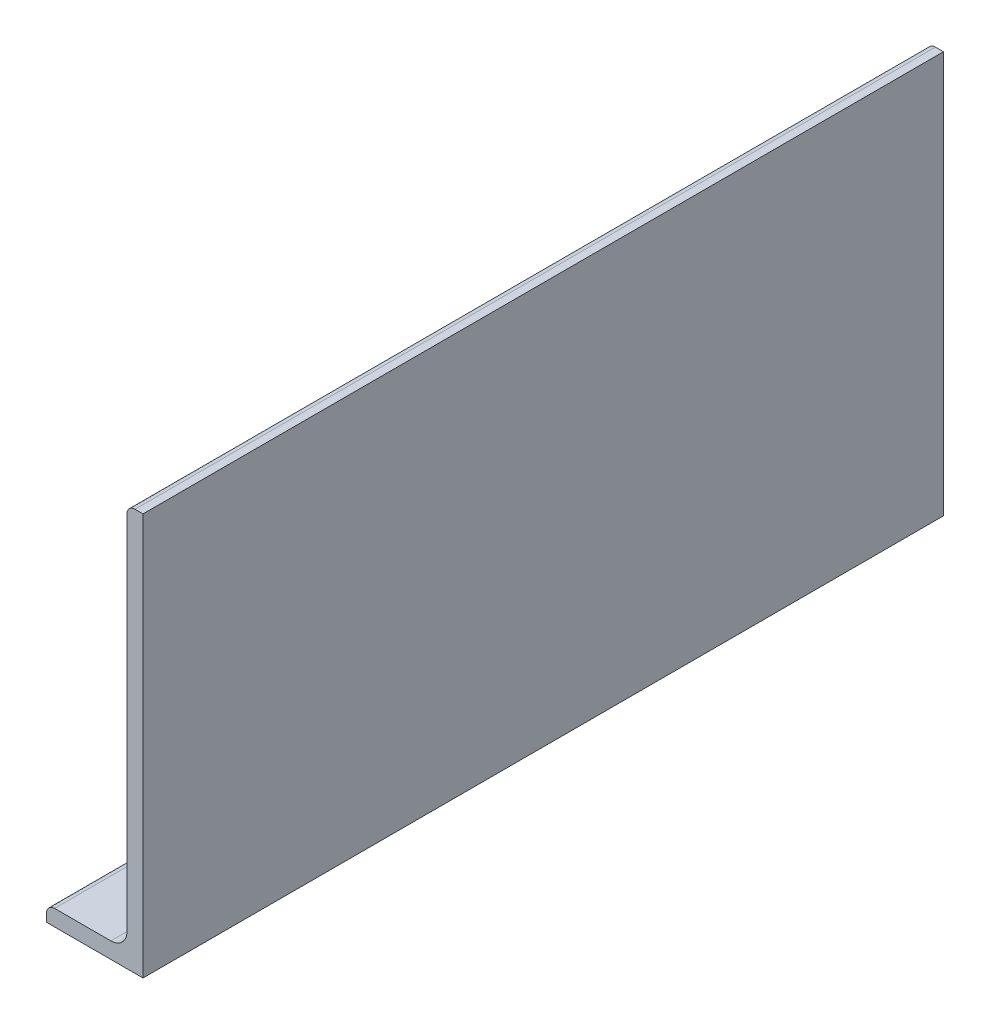
ISO-10303-21;
HEADER;
FILE_DESCRIPTION(('STEP AP214'),'2;1');
FILE_NAME('part.step','',(''),(''),'','','');
FILE_SCHEMA(('AUTOMOTIVE_DESIGN { 1 0 10303 214 1 1 1 1 }'));
ENDSEC;
DATA;
#1=APPLICATION_CONTEXT('core data for automotive mechanical design processes');
#2=APPLICATION_PROTOCOL_DEFINITION('international standard','automotive_design',2000,#1);
#3=PRODUCT_CONTEXT('',#1,'mechanical');
#4=PRODUCT('Part','Part','',(#3));
#5=PRODUCT_RELATED_PRODUCT_CATEGORY('part','',(#4));
#6=PRODUCT_DEFINITION_FORMATION('','',#4);
#7=PRODUCT_DEFINITION_CONTEXT('part definition',#1,'design');
#8=PRODUCT_DEFINITION('design','',#6,#7);
#9=PRODUCT_DEFINITION_SHAPE('','',#8);
#10=(LENGTH_UNIT() NAMED_UNIT(*) SI_UNIT(.MILLI.,.METRE.));
#11=(NAMED_UNIT(*) PLANE_ANGLE_UNIT() SI_UNIT($,.RADIAN.));
#12=(NAMED_UNIT(*) SI_UNIT($,.STERADIAN.) SOLID_ANGLE_UNIT());
#13=UNCERTAINTY_MEASURE_WITH_UNIT(LENGTH_MEASURE(1.E-05),#10,'distance_accuracy_value','');
#14=(GEOMETRIC_REPRESENTATION_CONTEXT(3) GLOBAL_UNCERTAINTY_ASSIGNED_CONTEXT((#13)) GLOBAL_UNIT_ASSIGNED_CONTEXT((#10,
#11,#12)) REPRESENTATION_CONTEXT('',''));
#15=CARTESIAN_POINT('',(0.,0.,0.));
#16=DIRECTION('',(0.,0.,1.));
#17=DIRECTION('',(1.,0.,0.));
#18=AXIS2_PLACEMENT_3D('',#15,#16,#17);
#19=CARTESIAN_POINT('',(272.72957772396,-5.49003400471423,99.58));
#20=DIRECTION('',(0.,-1.,0.));
#21=DIRECTION('',(0.,0.,-1.));
#22=AXIS2_PLACEMENT_3D('',#19,#20,#21);
#23=PLANE('',#22);
#24=DIRECTION('',(-1.,0.,0.));
#25=VECTOR('',#24,1.);
#26=CARTESIAN_POINT('',(272.72957772396,-5.49003400471423,0.));
#27=LINE('',#26,#25);
#28=CARTESIAN_POINT('',(274.72957772396,-5.49003400471423,0.));
#29=VERTEX_POINT('',#28);
#30=CARTESIAN_POINT('',(273.72957772396,-5.49003400471423,0.));
#31=VERTEX_POINT('',#30);
#32=EDGE_CURVE('E135',#29,#31,#27,.T.);
#33=ORIENTED_EDGE('',*,*,#32,.T.);
#34=DIRECTION('',(0.,0.,-1.));
#35=VECTOR('',#34,1.);
#36=CARTESIAN_POINT('',(273.72957772396,-5.49003400471423,99.58));
#37=LINE('',#36,#35);
#38=CARTESIAN_POINT('',(273.72957772396,-5.49003400471423,99.58));
#39=VERTEX_POINT('',#38);
#40=EDGE_CURVE('E167',#31,#39,#37,.F.);
#41=ORIENTED_EDGE('',*,*,#40,.T.);
#42=DIRECTION('',(-1.,0.,0.));
#43=VECTOR('',#42,1.);
#44=CARTESIAN_POINT('',(272.72957772396,-5.49003400471423,99.58));
#45=LINE('',#44,#43);
#46=CARTESIAN_POINT('',(274.72957772396,-5.49003400471423,99.58));
#47=VERTEX_POINT('',#46);
#48=EDGE_CURVE('E148',#47,#39,#45,.T.);
#49=ORIENTED_EDGE('',*,*,#48,.F.);
#50=DIRECTION('',(0.,0.,-1.));
#51=VECTOR('',#50,1.);
#52=CARTESIAN_POINT('',(274.72957772396,-5.49003400471423,99.58));
#53=LINE('',#52,#51);
#54=EDGE_CURVE('E131',#47,#29,#53,.T.);
#55=ORIENTED_EDGE('',*,*,#54,.T.);
#56=EDGE_LOOP('',(#33,#41,#49,#55));
#57=FACE_BOUND('',#56,.T.);
#58=ADVANCED_FACE('F33',(#57),#23,.F.);
#59=CARTESIAN_POINT('',(272.72957772396,-53.4900340047142,99.58));
#60=DIRECTION('',(1.,0.,0.));
#61=DIRECTION('',(0.,0.,-1.));
#62=AXIS2_PLACEMENT_3D('',#59,#60,#61);
#63=PLANE('',#62);
#64=DIRECTION('',(0.,-1.,0.));
#65=VECTOR('',#64,1.);
#66=CARTESIAN_POINT('',(272.72957772396,-53.4900340047142,0.));
#67=LINE('',#66,#65);
#68=CARTESIAN_POINT('',(272.72957772396,-6.49003400471424,0.));
#69=VERTEX_POINT('',#68);
#70=CARTESIAN_POINT('',(272.72957772396,-51.4900340047142,0.));
#71=VERTEX_POINT('',#70);
#72=EDGE_CURVE('E138',#69,#71,#67,.T.);
#73=ORIENTED_EDGE('',*,*,#72,.T.);
#74=DIRECTION('',(0.,0.,-1.));
#75=VECTOR('',#74,1.);
#76=CARTESIAN_POINT('',(272.72957772396,-51.4900340047142,99.58));
#77=LINE('',#76,#75);
#78=CARTESIAN_POINT('',(272.72957772396,-51.4900340047142,99.58));
#79=VERTEX_POINT('',#78);
#80=EDGE_CURVE('E54',#71,#79,#77,.F.);
#81=ORIENTED_EDGE('',*,*,#80,.T.);
#82=DIRECTION('',(0.,-1.,0.));
#83=VECTOR('',#82,1.);
#84=CARTESIAN_POINT('',(272.72957772396,-53.4900340047142,99.58));
#85=LINE('',#84,#83);
#86=CARTESIAN_POINT('',(272.72957772396,-6.49003400471424,99.58));
#87=VERTEX_POINT('',#86);
#88=EDGE_CURVE('E240',#87,#79,#85,.T.);
#89=ORIENTED_EDGE('',*,*,#88,.F.);
#90=DIRECTION('',(0.,0.,-1.));
#91=VECTOR('',#90,1.);
#92=CARTESIAN_POINT('',(272.72957772396,-6.49003400471423,99.58));
#93=LINE('',#92,#91);
#94=EDGE_CURVE('E164',#87,#69,#93,.T.);
#95=ORIENTED_EDGE('',*,*,#94,.T.);
#96=EDGE_LOOP('',(#73,#81,#89,#95));
#97=FACE_BOUND('',#96,.T.);
#98=ADVANCED_FACE('F193',(#97),#63,.F.);
#99=CARTESIAN_POINT('',(262.72957772396,-53.4900340047142,99.58));
#100=DIRECTION('',(0.,-1.,0.));
#101=DIRECTION('',(1.,0.,0.));
#102=AXIS2_PLACEMENT_3D('',#99,#100,#101);
#103=PLANE('',#102);
#104=CARTESIAN_POINT('',(267.22957772396,-53.4900340047142,20.));
#105=DIRECTION('',(0.,1.,0.));
#106=DIRECTION('',(-1.,0.,0.));
#107=AXIS2_PLACEMENT_3D('',#104,#105,#106);
#108=CIRCLE('',#107,1.59999999999996);
#109=CARTESIAN_POINT('',(265.62957772396,-53.4900340047142,20.));
#110=VERTEX_POINT('',#109);
#111=EDGE_CURVE('E228',#110,#110,#108,.T.);
#112=ORIENTED_EDGE('',*,*,#111,.F.);
#113=EDGE_LOOP('',(#112));
#114=FACE_BOUND('',#113,.T.);
#115=CARTESIAN_POINT('',(267.22957772396,-53.4900340047142,79.58));
#116=DIRECTION('',(0.,1.,0.));
#117=DIRECTION('',(-1.,0.,0.));
#118=AXIS2_PLACEMENT_3D('',#115,#116,#117);
#119=CIRCLE('',#118,1.59999999999997);
#120=CARTESIAN_POINT('',(265.62957772396,-53.4900340047142,79.58));
#121=VERTEX_POINT('',#120);
#122=EDGE_CURVE('E233',#121,#121,#119,.T.);
#123=ORIENTED_EDGE('',*,*,#122,.F.);
#124=EDGE_LOOP('',(#123));
#125=FACE_BOUND('',#124,.T.);
#126=DIRECTION('',(-1.,0.,0.));
#127=VECTOR('',#126,1.);
#128=CARTESIAN_POINT('',(262.72957772396,-53.4900340047142,99.58));
#129=LINE('',#128,#127);
#130=CARTESIAN_POINT('',(270.72957772396,-53.4900340047142,99.58));
#131=VERTEX_POINT('',#130);
#132=CARTESIAN_POINT('',(263.72957772396,-53.4900340047142,99.58));
#133=VERTEX_POINT('',#132);
#134=EDGE_CURVE('E114',#131,#133,#129,.T.);
#135=ORIENTED_EDGE('',*,*,#134,.F.);
#136=DIRECTION('',(0.,0.,-1.));
#137=VECTOR('',#136,1.);
#138=CARTESIAN_POINT('',(270.72957772396,-53.4900340047142,0.));
#139=LINE('',#138,#137);
#140=CARTESIAN_POINT('',(270.72957772396,-53.4900340047142,0.));
#141=VERTEX_POINT('',#140);
#142=EDGE_CURVE('E169',#131,#141,#139,.T.);
#143=ORIENTED_EDGE('',*,*,#142,.T.);
#144=DIRECTION('',(-1.,0.,0.));
#145=VECTOR('',#144,1.);
#146=CARTESIAN_POINT('',(262.72957772396,-53.4900340047142,0.));
#147=LINE('',#146,#145);
#148=CARTESIAN_POINT('',(263.72957772396,-53.4900340047142,0.));
#149=VERTEX_POINT('',#148);
#150=EDGE_CURVE('E141',#141,#149,#147,.T.);
#151=ORIENTED_EDGE('',*,*,#150,.T.);
#152=DIRECTION('',(0.,0.,-1.));
#153=VECTOR('',#152,1.);
#154=CARTESIAN_POINT('',(263.72957772396,-53.4900340047142,99.58));
#155=LINE('',#154,#153);
#156=EDGE_CURVE('E158',#149,#133,#155,.F.);
#157=ORIENTED_EDGE('',*,*,#156,.T.);
#158=EDGE_LOOP('',(#135,#143,#151,#157));
#159=FACE_BOUND('',#158,.T.);
#160=ADVANCED_FACE('F175',(#114,#125,#159),#103,.F.);
#161=CARTESIAN_POINT('',(262.72957772396,-55.4900340047142,99.58));
#162=DIRECTION('',(1.,0.,0.));
#163=DIRECTION('',(0.,0.,-1.));
#164=AXIS2_PLACEMENT_3D('',#161,#162,#163);
#165=PLANE('',#164);
#166=DIRECTION('',(0.,-1.,0.));
#167=VECTOR('',#166,1.);
#168=CARTESIAN_POINT('',(262.72957772396,-55.4900340047142,99.58));
#169=LINE('',#168,#167);
#170=CARTESIAN_POINT('',(262.72957772396,-54.4900340047142,99.58));
#171=VERTEX_POINT('',#170);
#172=CARTESIAN_POINT('',(262.72957772396,-55.4900340047142,99.58));
#173=VERTEX_POINT('',#172);
#174=EDGE_CURVE('E103',#171,#173,#169,.T.);
#175=ORIENTED_EDGE('',*,*,#174,.F.);
#176=DIRECTION('',(0.,0.,-1.));
#177=VECTOR('',#176,1.);
#178=CARTESIAN_POINT('',(262.72957772396,-54.4900340047142,99.58));
#179=LINE('',#178,#177);
#180=CARTESIAN_POINT('',(262.72957772396,-54.4900340047142,0.));
#181=VERTEX_POINT('',#180);
#182=EDGE_CURVE('E123',#171,#181,#179,.T.);
#183=ORIENTED_EDGE('',*,*,#182,.T.);
#184=DIRECTION('',(0.,-1.,0.));
#185=VECTOR('',#184,1.);
#186=CARTESIAN_POINT('',(262.72957772396,-55.4900340047142,0.));
#187=LINE('',#186,#185);
#188=CARTESIAN_POINT('',(262.72957772396,-55.4900340047142,0.));
#189=VERTEX_POINT('',#188);
#190=EDGE_CURVE('E120',#181,#189,#187,.T.);
#191=ORIENTED_EDGE('',*,*,#190,.T.);
#192=DIRECTION('',(0.,0.,-1.));
#193=VECTOR('',#192,1.);
#194=CARTESIAN_POINT('',(262.72957772396,-55.4900340047142,99.58));
#195=LINE('',#194,#193);
#196=EDGE_CURVE('E117',#173,#189,#195,.T.);
#197=ORIENTED_EDGE('',*,*,#196,.F.);
#198=EDGE_LOOP('',(#175,#183,#191,#197));
#199=FACE_BOUND('',#198,.T.);
#200=ADVANCED_FACE('F118',(#199),#165,.F.);
#201=CARTESIAN_POINT('',(274.72957772396,-55.4900340047142,99.58));
#202=DIRECTION('',(0.,1.,0.));
#203=DIRECTION('',(-1.,0.,0.));
#204=AXIS2_PLACEMENT_3D('',#201,#202,#203);
#205=PLANE('',#204);
#206=CARTESIAN_POINT('',(267.22957772396,-55.4900340047142,20.));
#207=DIRECTION('',(0.,1.,0.));
#208=DIRECTION('',(-1.,0.,0.));
#209=AXIS2_PLACEMENT_3D('',#206,#207,#208);
#210=CIRCLE('',#209,1.59999999999996);
#211=CARTESIAN_POINT('',(265.62957772396,-55.4900340047142,20.));
#212=VERTEX_POINT('',#211);
#213=EDGE_CURVE('E139',#212,#212,#210,.T.);
#214=ORIENTED_EDGE('',*,*,#213,.T.);
#215=EDGE_LOOP('',(#214));
#216=FACE_BOUND('',#215,.T.);
#217=CARTESIAN_POINT('',(267.22957772396,-55.4900340047142,79.58));
#218=DIRECTION('',(0.,1.,0.));
#219=DIRECTION('',(-1.,0.,0.));
#220=AXIS2_PLACEMENT_3D('',#217,#218,#219);
#221=CIRCLE('',#220,1.59999999999997);
#222=CARTESIAN_POINT('',(265.62957772396,-55.4900340047142,79.58));
#223=VERTEX_POINT('',#222);
#224=EDGE_CURVE('E229',#223,#223,#221,.T.);
#225=ORIENTED_EDGE('',*,*,#224,.T.);
#226=EDGE_LOOP('',(#225));
#227=FACE_BOUND('',#226,.T.);
#228=DIRECTION('',(1.,0.,0.));
#229=VECTOR('',#228,1.);
#230=CARTESIAN_POINT('',(274.72957772396,-55.4900340047142,0.));
#231=LINE('',#230,#229);
#232=CARTESIAN_POINT('',(274.72957772396,-55.4900340047142,0.));
#233=VERTEX_POINT('',#232);
#234=EDGE_CURVE('E144',#189,#233,#231,.T.);
#235=ORIENTED_EDGE('',*,*,#234,.T.);
#236=DIRECTION('',(0.,0.,-1.));
#237=VECTOR('',#236,1.);
#238=CARTESIAN_POINT('',(274.72957772396,-55.4900340047142,99.58));
#239=LINE('',#238,#237);
#240=CARTESIAN_POINT('',(274.72957772396,-55.4900340047142,99.58));
#241=VERTEX_POINT('',#240);
#242=EDGE_CURVE('E124',#241,#233,#239,.T.);
#243=ORIENTED_EDGE('',*,*,#242,.F.);
#244=DIRECTION('',(1.,0.,0.));
#245=VECTOR('',#244,1.);
#246=CARTESIAN_POINT('',(274.72957772396,-55.4900340047142,99.58));
#247=LINE('',#246,#245);
#248=EDGE_CURVE('E107',#173,#241,#247,.T.);
#249=ORIENTED_EDGE('',*,*,#248,.F.);
#250=ORIENTED_EDGE('',*,*,#196,.T.);
#251=EDGE_LOOP('',(#235,#243,#249,#250));
#252=FACE_BOUND('',#251,.T.);
#253=ADVANCED_FACE('F126',(#216,#227,#252),#205,.F.);
#254=CARTESIAN_POINT('',(274.72957772396,-5.49003400471423,99.58));
#255=DIRECTION('',(-1.,0.,0.));
#256=DIRECTION('',(0.,0.,1.));
#257=AXIS2_PLACEMENT_3D('',#254,#255,#256);
#258=PLANE('',#257);
#259=DIRECTION('',(0.,1.,0.));
#260=VECTOR('',#259,1.);
#261=CARTESIAN_POINT('',(274.72957772396,-5.49003400471423,0.));
#262=LINE('',#261,#260);
#263=EDGE_CURVE('E146',#233,#29,#262,.T.);
#264=ORIENTED_EDGE('',*,*,#263,.T.);
#265=ORIENTED_EDGE('',*,*,#54,.F.);
#266=DIRECTION('',(0.,1.,0.));
#267=VECTOR('',#266,1.);
#268=CARTESIAN_POINT('',(274.72957772396,-5.49003400471423,99.58));
#269=LINE('',#268,#267);
#270=EDGE_CURVE('E129',#241,#47,#269,.T.);
#271=ORIENTED_EDGE('',*,*,#270,.F.);
#272=ORIENTED_EDGE('',*,*,#242,.T.);
#273=EDGE_LOOP('',(#264,#265,#271,#272));
#274=FACE_BOUND('',#273,.T.);
#275=ADVANCED_FACE('F207',(#274),#258,.F.);
#276=CARTESIAN_POINT('',(0.,0.,99.58));
#277=DIRECTION('',(0.,0.,-1.));
#278=DIRECTION('',(-1.,0.,0.));
#279=AXIS2_PLACEMENT_3D('',#276,#277,#278);
#280=PLANE('',#279);
#281=ORIENTED_EDGE('',*,*,#88,.T.);
#282=CARTESIAN_POINT('',(270.72957772396,-51.4900340047142,99.58));
#283=DIRECTION('',(0.,0.,-1.));
#284=DIRECTION('',(-1.,0.,0.));
#285=AXIS2_PLACEMENT_3D('',#282,#283,#284);
#286=CIRCLE('',#285,2.);
#287=EDGE_CURVE('E11',#79,#131,#286,.T.);
#288=ORIENTED_EDGE('',*,*,#287,.T.);
#289=ORIENTED_EDGE('',*,*,#134,.T.);
#290=CARTESIAN_POINT('',(263.72957772396,-54.4900340047142,99.58));
#291=DIRECTION('',(0.,0.,-1.));
#292=DIRECTION('',(-1.,0.,0.));
#293=AXIS2_PLACEMENT_3D('',#290,#291,#292);
#294=CIRCLE('',#293,1.);
#295=EDGE_CURVE('E110',#133,#171,#294,.F.);
#296=ORIENTED_EDGE('',*,*,#295,.T.);
#297=ORIENTED_EDGE('',*,*,#174,.T.);
#298=ORIENTED_EDGE('',*,*,#248,.T.);
#299=ORIENTED_EDGE('',*,*,#270,.T.);
#300=ORIENTED_EDGE('',*,*,#48,.T.);
#301=CARTESIAN_POINT('',(273.72957772396,-6.49003400471423,99.58));
#302=DIRECTION('',(0.,0.,-1.));
#303=DIRECTION('',(-1.,0.,0.));
#304=AXIS2_PLACEMENT_3D('',#301,#302,#303);
#305=CIRCLE('',#304,1.);
#306=EDGE_CURVE('E161',#39,#87,#305,.F.);
#307=ORIENTED_EDGE('',*,*,#306,.T.);
#308=EDGE_LOOP('',(#281,#288,#289,#296,#297,#298,#299,#300,#307));
#309=FACE_BOUND('',#308,.T.);
#310=ADVANCED_FACE('F105',(#309),#280,.F.);
#311=CARTESIAN_POINT('',(0.,0.,0.));
#312=DIRECTION('',(0.,0.,-1.));
#313=DIRECTION('',(-1.,0.,0.));
#314=AXIS2_PLACEMENT_3D('',#311,#312,#313);
#315=PLANE('',#314);
#316=ORIENTED_EDGE('',*,*,#190,.F.);
#317=CARTESIAN_POINT('',(263.72957772396,-54.4900340047142,0.));
#318=DIRECTION('',(0.,0.,-1.));
#319=DIRECTION('',(-1.,0.,0.));
#320=AXIS2_PLACEMENT_3D('',#317,#318,#319);
#321=CIRCLE('',#320,1.);
#322=EDGE_CURVE('E155',#181,#149,#321,.T.);
#323=ORIENTED_EDGE('',*,*,#322,.T.);
#324=ORIENTED_EDGE('',*,*,#150,.F.);
#325=CARTESIAN_POINT('',(270.72957772396,-51.4900340047142,0.));
#326=DIRECTION('',(0.,0.,-1.));
#327=DIRECTION('',(-1.,0.,0.));
#328=AXIS2_PLACEMENT_3D('',#325,#326,#327);
#329=CIRCLE('',#328,2.);
#330=EDGE_CURVE('E41',#141,#71,#329,.F.);
#331=ORIENTED_EDGE('',*,*,#330,.T.);
#332=ORIENTED_EDGE('',*,*,#72,.F.);
#333=CARTESIAN_POINT('',(273.72957772396,-6.49003400471423,0.));
#334=DIRECTION('',(0.,0.,-1.));
#335=DIRECTION('',(-1.,0.,0.));
#336=AXIS2_PLACEMENT_3D('',#333,#334,#335);
#337=CIRCLE('',#336,1.);
#338=EDGE_CURVE('E153',#69,#31,#337,.T.);
#339=ORIENTED_EDGE('',*,*,#338,.T.);
#340=ORIENTED_EDGE('',*,*,#32,.F.);
#341=ORIENTED_EDGE('',*,*,#263,.F.);
#342=ORIENTED_EDGE('',*,*,#234,.F.);
#343=EDGE_LOOP('',(#316,#323,#324,#331,#332,#339,#340,#341,#342));
#344=FACE_BOUND('',#343,.T.);
#345=ADVANCED_FACE('F178',(#344),#315,.T.);
#346=CARTESIAN_POINT('',(263.72957772396,-54.4900340047142,99.58));
#347=DIRECTION('',(0.,0.,-1.));
#348=DIRECTION('',(-1.,0.,0.));
#349=AXIS2_PLACEMENT_3D('',#346,#347,#348);
#350=CYLINDRICAL_SURFACE('',#349,1.);
#351=ORIENTED_EDGE('',*,*,#295,.F.);
#352=ORIENTED_EDGE('',*,*,#156,.F.);
#353=ORIENTED_EDGE('',*,*,#322,.F.);
#354=ORIENTED_EDGE('',*,*,#182,.F.);
#355=EDGE_LOOP('',(#351,#352,#353,#354));
#356=FACE_BOUND('',#355,.T.);
#357=ADVANCED_FACE('F181',(#356),#350,.T.);
#358=CARTESIAN_POINT('',(273.72957772396,-6.49003400471423,99.58));
#359=DIRECTION('',(0.,0.,-1.));
#360=DIRECTION('',(-1.,0.,0.));
#361=AXIS2_PLACEMENT_3D('',#358,#359,#360);
#362=CYLINDRICAL_SURFACE('',#361,1.);
#363=ORIENTED_EDGE('',*,*,#306,.F.);
#364=ORIENTED_EDGE('',*,*,#40,.F.);
#365=ORIENTED_EDGE('',*,*,#338,.F.);
#366=ORIENTED_EDGE('',*,*,#94,.F.);
#367=EDGE_LOOP('',(#363,#364,#365,#366));
#368=FACE_BOUND('',#367,.T.);
#369=ADVANCED_FACE('F183',(#368),#362,.T.);
#370=CARTESIAN_POINT('',(270.72957772396,-51.4900340047142,99.58));
#371=DIRECTION('',(0.,0.,1.));
#372=DIRECTION('',(1.,0.,0.));
#373=AXIS2_PLACEMENT_3D('',#370,#371,#372);
#374=CYLINDRICAL_SURFACE('',#373,2.);
#375=ORIENTED_EDGE('',*,*,#287,.F.);
#376=ORIENTED_EDGE('',*,*,#80,.F.);
#377=ORIENTED_EDGE('',*,*,#330,.F.);
#378=ORIENTED_EDGE('',*,*,#142,.F.);
#379=EDGE_LOOP('',(#375,#376,#377,#378));
#380=FACE_BOUND('',#379,.T.);
#381=ADVANCED_FACE('F35',(#380),#374,.F.);
#382=CARTESIAN_POINT('',(267.22957772396,-55.4900340047142,79.58));
#383=DIRECTION('',(0.,1.,0.));
#384=DIRECTION('',(-1.,0.,0.));
#385=AXIS2_PLACEMENT_3D('',#382,#383,#384);
#386=CYLINDRICAL_SURFACE('',#385,1.59999999999997);
#387=ORIENTED_EDGE('',*,*,#224,.F.);
#388=EDGE_LOOP('',(#387));
#389=FACE_BOUND('',#388,.T.);
#390=ORIENTED_EDGE('',*,*,#122,.T.);
#391=EDGE_LOOP('',(#390));
#392=FACE_BOUND('',#391,.T.);
#393=ADVANCED_FACE('F214',(#389,#392),#386,.F.);
#394=CARTESIAN_POINT('',(267.22957772396,-55.4900340047142,20.));
#395=DIRECTION('',(0.,1.,0.));
#396=DIRECTION('',(-1.,0.,0.));
#397=AXIS2_PLACEMENT_3D('',#394,#395,#396);
#398=CYLINDRICAL_SURFACE('',#397,1.59999999999996);
#399=ORIENTED_EDGE('',*,*,#213,.F.);
#400=EDGE_LOOP('',(#399));
#401=FACE_BOUND('',#400,.T.);
#402=ORIENTED_EDGE('',*,*,#111,.T.);
#403=EDGE_LOOP('',(#402));
#404=FACE_BOUND('',#403,.T.);
#405=ADVANCED_FACE('F217',(#401,#404),#398,.F.);
#406=CLOSED_SHELL('',(#58,#98,#160,#200,#253,#275,#310,#345,#357,#369,#381,#393,#405));
#407=MANIFOLD_SOLID_BREP('B2',#406);
#408=ADVANCED_BREP_SHAPE_REPRESENTATION('',(#18,#407),#14);
#409=SHAPE_DEFINITION_REPRESENTATION(#9,#408);
ENDSEC;
END-ISO-10303-21;
